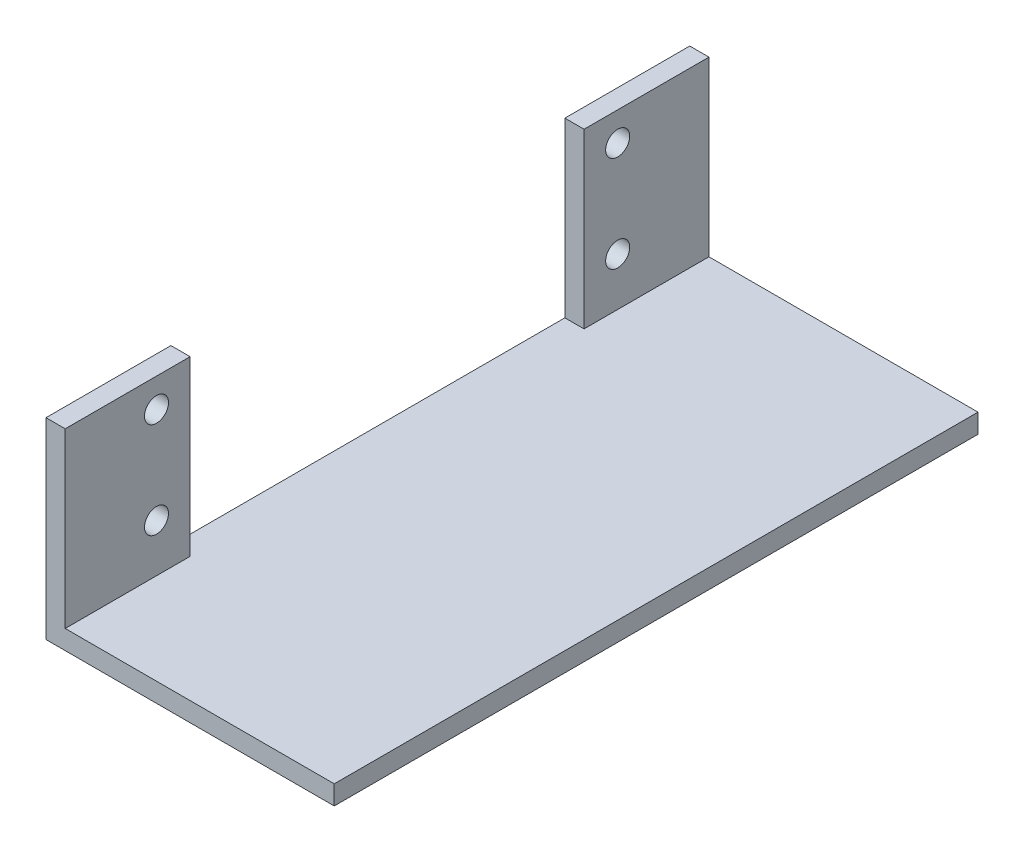
ISO-10303-21;
HEADER;
FILE_DESCRIPTION(('STEP AP214'),'2;1');
FILE_NAME('part.step','',(''),(''),'','','');
FILE_SCHEMA(('AUTOMOTIVE_DESIGN { 1 0 10303 214 1 1 1 1 }'));
ENDSEC;
DATA;
#1=APPLICATION_CONTEXT('core data for automotive mechanical design processes');
#2=APPLICATION_PROTOCOL_DEFINITION('international standard','automotive_design',2000,#1);
#3=PRODUCT_CONTEXT('',#1,'mechanical');
#4=PRODUCT('Part','Part','',(#3));
#5=PRODUCT_RELATED_PRODUCT_CATEGORY('part','',(#4));
#6=PRODUCT_DEFINITION_FORMATION('','',#4);
#7=PRODUCT_DEFINITION_CONTEXT('part definition',#1,'design');
#8=PRODUCT_DEFINITION('design','',#6,#7);
#9=PRODUCT_DEFINITION_SHAPE('','',#8);
#10=(LENGTH_UNIT() NAMED_UNIT(*) SI_UNIT(.MILLI.,.METRE.));
#11=(NAMED_UNIT(*) PLANE_ANGLE_UNIT() SI_UNIT($,.RADIAN.));
#12=(NAMED_UNIT(*) SI_UNIT($,.STERADIAN.) SOLID_ANGLE_UNIT());
#13=UNCERTAINTY_MEASURE_WITH_UNIT(LENGTH_MEASURE(1.E-05),#10,'distance_accuracy_value','');
#14=(GEOMETRIC_REPRESENTATION_CONTEXT(3) GLOBAL_UNCERTAINTY_ASSIGNED_CONTEXT((#13)) GLOBAL_UNIT_ASSIGNED_CONTEXT((#10,
#11,#12)) REPRESENTATION_CONTEXT('',''));
#15=CARTESIAN_POINT('',(0.,0.,0.));
#16=DIRECTION('',(0.,0.,1.));
#17=DIRECTION('',(1.,0.,0.));
#18=AXIS2_PLACEMENT_3D('',#15,#16,#17);
#19=CARTESIAN_POINT('',(2.,20.,33.5));
#20=DIRECTION('',(1.,0.,0.));
#21=DIRECTION('',(0.,0.,-1.));
#22=AXIS2_PLACEMENT_3D('',#19,#20,#21);
#23=PLANE('',#22);
#24=DIRECTION('',(0.,1.,0.));
#25=VECTOR('',#24,1.);
#26=CARTESIAN_POINT('',(2.,20.,20.5));
#27=LINE('',#26,#25);
#28=CARTESIAN_POINT('',(2.,2.,20.5));
#29=VERTEX_POINT('',#28);
#30=CARTESIAN_POINT('',(2.,20.,20.5));
#31=VERTEX_POINT('',#30);
#32=EDGE_CURVE('E111',#29,#31,#27,.T.);
#33=ORIENTED_EDGE('',*,*,#32,.T.);
#34=DIRECTION('',(0.,0.,-1.));
#35=VECTOR('',#34,1.);
#36=CARTESIAN_POINT('',(2.,20.,33.5));
#37=LINE('',#36,#35);
#38=CARTESIAN_POINT('',(2.,20.,33.5));
#39=VERTEX_POINT('',#38);
#40=EDGE_CURVE('E104',#39,#31,#37,.T.);
#41=ORIENTED_EDGE('',*,*,#40,.F.);
#42=DIRECTION('',(0.,1.,0.));
#43=VECTOR('',#42,1.);
#44=CARTESIAN_POINT('',(2.,20.,33.5));
#45=LINE('',#44,#43);
#46=CARTESIAN_POINT('',(2.,2.,33.5));
#47=VERTEX_POINT('',#46);
#48=EDGE_CURVE('E108',#39,#47,#45,.F.);
#49=ORIENTED_EDGE('',*,*,#48,.T.);
#50=DIRECTION('',(0.,0.,-1.));
#51=VECTOR('',#50,1.);
#52=CARTESIAN_POINT('',(2.,2.,33.5));
#53=LINE('',#52,#51);
#54=EDGE_CURVE('E152',#47,#29,#53,.T.);
#55=ORIENTED_EDGE('',*,*,#54,.T.);
#56=EDGE_LOOP('',(#33,#41,#49,#55));
#57=FACE_BOUND('',#56,.T.);
#58=CARTESIAN_POINT('',(2.,17.,24.));
#59=DIRECTION('',(1.,0.,0.));
#60=DIRECTION('',(0.,0.,-1.));
#61=AXIS2_PLACEMENT_3D('',#58,#59,#60);
#62=CIRCLE('',#61,1.25);
#63=CARTESIAN_POINT('',(2.,17.,22.75));
#64=VERTEX_POINT('',#63);
#65=EDGE_CURVE('E209',#64,#64,#62,.F.);
#66=ORIENTED_EDGE('',*,*,#65,.T.);
#67=EDGE_LOOP('',(#66));
#68=FACE_BOUND('',#67,.T.);
#69=CARTESIAN_POINT('',(2.,7.,24.));
#70=DIRECTION('',(1.,0.,0.));
#71=DIRECTION('',(0.,0.,-1.));
#72=AXIS2_PLACEMENT_3D('',#69,#70,#71);
#73=CIRCLE('',#72,1.25);
#74=CARTESIAN_POINT('',(2.,7.,22.75));
#75=VERTEX_POINT('',#74);
#76=EDGE_CURVE('E208',#75,#75,#73,.F.);
#77=ORIENTED_EDGE('',*,*,#76,.T.);
#78=EDGE_LOOP('',(#77));
#79=FACE_BOUND('',#78,.T.);
#80=ADVANCED_FACE('F33',(#57,#68,#79),#23,.T.);
#81=CARTESIAN_POINT('',(0.,20.,33.5));
#82=DIRECTION('',(0.,1.,0.));
#83=DIRECTION('',(0.,0.,1.));
#84=AXIS2_PLACEMENT_3D('',#81,#82,#83);
#85=PLANE('',#84);
#86=DIRECTION('',(-1.,0.,0.));
#87=VECTOR('',#86,1.);
#88=CARTESIAN_POINT('',(46.7772263544762,20.,20.5));
#89=LINE('',#88,#87);
#90=CARTESIAN_POINT('',(0.,20.,20.5));
#91=VERTEX_POINT('',#90);
#92=EDGE_CURVE('E195',#31,#91,#89,.T.);
#93=ORIENTED_EDGE('',*,*,#92,.T.);
#94=DIRECTION('',(0.,0.,-1.));
#95=VECTOR('',#94,1.);
#96=CARTESIAN_POINT('',(0.,20.,33.5));
#97=LINE('',#96,#95);
#98=CARTESIAN_POINT('',(0.,20.,33.5));
#99=VERTEX_POINT('',#98);
#100=EDGE_CURVE('E126',#99,#91,#97,.T.);
#101=ORIENTED_EDGE('',*,*,#100,.F.);
#102=DIRECTION('',(1.,0.,0.));
#103=VECTOR('',#102,1.);
#104=CARTESIAN_POINT('',(0.,20.,33.5));
#105=LINE('',#104,#103);
#106=EDGE_CURVE('E120',#99,#39,#105,.T.);
#107=ORIENTED_EDGE('',*,*,#106,.T.);
#108=ORIENTED_EDGE('',*,*,#40,.T.);
#109=EDGE_LOOP('',(#93,#101,#107,#108));
#110=FACE_BOUND('',#109,.T.);
#111=ADVANCED_FACE('F124',(#110),#85,.T.);
#112=CARTESIAN_POINT('',(0.,0.,33.5));
#113=DIRECTION('',(0.,1.,0.));
#114=DIRECTION('',(0.,0.,1.));
#115=AXIS2_PLACEMENT_3D('',#112,#113,#114);
#116=PLANE('',#115);
#117=DIRECTION('',(1.,0.,0.));
#118=VECTOR('',#117,1.);
#119=CARTESIAN_POINT('',(0.,0.,-33.5));
#120=LINE('',#119,#118);
#121=CARTESIAN_POINT('',(0.,0.,-33.5));
#122=VERTEX_POINT('',#121);
#123=CARTESIAN_POINT('',(30.,0.,-33.5));
#124=VERTEX_POINT('',#123);
#125=EDGE_CURVE('E132',#122,#124,#120,.T.);
#126=ORIENTED_EDGE('',*,*,#125,.T.);
#127=DIRECTION('',(0.,0.,-1.));
#128=VECTOR('',#127,1.);
#129=CARTESIAN_POINT('',(30.,0.,33.5));
#130=LINE('',#129,#128);
#131=CARTESIAN_POINT('',(30.,0.,33.5));
#132=VERTEX_POINT('',#131);
#133=EDGE_CURVE('E11',#132,#124,#130,.T.);
#134=ORIENTED_EDGE('',*,*,#133,.F.);
#135=DIRECTION('',(1.,0.,0.));
#136=VECTOR('',#135,1.);
#137=CARTESIAN_POINT('',(0.,0.,33.5));
#138=LINE('',#137,#136);
#139=CARTESIAN_POINT('',(0.,0.,33.5));
#140=VERTEX_POINT('',#139);
#141=EDGE_CURVE('E89',#140,#132,#138,.T.);
#142=ORIENTED_EDGE('',*,*,#141,.F.);
#143=DIRECTION('',(0.,0.,-1.));
#144=VECTOR('',#143,1.);
#145=CARTESIAN_POINT('',(0.,0.,33.5));
#146=LINE('',#145,#144);
#147=EDGE_CURVE('E128',#140,#122,#146,.T.);
#148=ORIENTED_EDGE('',*,*,#147,.T.);
#149=EDGE_LOOP('',(#126,#134,#142,#148));
#150=FACE_BOUND('',#149,.T.);
#151=ADVANCED_FACE('F35',(#150),#116,.F.);
#152=CARTESIAN_POINT('',(30.,2.,33.5));
#153=DIRECTION('',(1.,0.,0.));
#154=DIRECTION('',(0.,0.,-1.));
#155=AXIS2_PLACEMENT_3D('',#152,#153,#154);
#156=PLANE('',#155);
#157=DIRECTION('',(0.,-1.,0.));
#158=VECTOR('',#157,1.);
#159=CARTESIAN_POINT('',(30.,2.,-33.5));
#160=LINE('',#159,#158);
#161=CARTESIAN_POINT('',(30.,2.,-33.5));
#162=VERTEX_POINT('',#161);
#163=EDGE_CURVE('E135',#162,#124,#160,.T.);
#164=ORIENTED_EDGE('',*,*,#163,.F.);
#165=DIRECTION('',(0.,0.,-1.));
#166=VECTOR('',#165,1.);
#167=CARTESIAN_POINT('',(30.,2.,33.5));
#168=LINE('',#167,#166);
#169=CARTESIAN_POINT('',(30.,2.,33.5));
#170=VERTEX_POINT('',#169);
#171=EDGE_CURVE('E41',#170,#162,#168,.T.);
#172=ORIENTED_EDGE('',*,*,#171,.F.);
#173=DIRECTION('',(0.,-1.,0.));
#174=VECTOR('',#173,1.);
#175=CARTESIAN_POINT('',(30.,2.,33.5));
#176=LINE('',#175,#174);
#177=EDGE_CURVE('E218',#170,#132,#176,.T.);
#178=ORIENTED_EDGE('',*,*,#177,.T.);
#179=ORIENTED_EDGE('',*,*,#133,.T.);
#180=EDGE_LOOP('',(#164,#172,#178,#179));
#181=FACE_BOUND('',#180,.T.);
#182=ADVANCED_FACE('F160',(#181),#156,.T.);
#183=CARTESIAN_POINT('',(0.,2.,33.5));
#184=DIRECTION('',(0.,1.,0.));
#185=DIRECTION('',(0.,0.,1.));
#186=AXIS2_PLACEMENT_3D('',#183,#184,#185);
#187=PLANE('',#186);
#188=DIRECTION('',(1.,0.,0.));
#189=VECTOR('',#188,1.);
#190=CARTESIAN_POINT('',(0.,2.,-33.5));
#191=LINE('',#190,#189);
#192=CARTESIAN_POINT('',(2.,2.,-33.5));
#193=VERTEX_POINT('',#192);
#194=EDGE_CURVE('E139',#193,#162,#191,.T.);
#195=ORIENTED_EDGE('',*,*,#194,.F.);
#196=CARTESIAN_POINT('',(2.,2.,-20.5));
#197=VERTEX_POINT('',#196);
#198=EDGE_CURVE('E115',#197,#193,#53,.T.);
#199=ORIENTED_EDGE('',*,*,#198,.F.);
#200=DIRECTION('',(-1.,0.,0.));
#201=VECTOR('',#200,1.);
#202=CARTESIAN_POINT('',(46.7772263544762,2.,-20.5));
#203=LINE('',#202,#201);
#204=CARTESIAN_POINT('',(0.,2.,-20.5));
#205=VERTEX_POINT('',#204);
#206=EDGE_CURVE('E176',#197,#205,#203,.T.);
#207=ORIENTED_EDGE('',*,*,#206,.T.);
#208=DIRECTION('',(0.,0.,1.));
#209=VECTOR('',#208,1.);
#210=CARTESIAN_POINT('',(0.,2.,-20.5));
#211=LINE('',#210,#209);
#212=CARTESIAN_POINT('',(0.,2.,20.5));
#213=VERTEX_POINT('',#212);
#214=EDGE_CURVE('E261',#205,#213,#211,.T.);
#215=ORIENTED_EDGE('',*,*,#214,.T.);
#216=DIRECTION('',(-1.,0.,0.));
#217=VECTOR('',#216,1.);
#218=CARTESIAN_POINT('',(46.7772263544762,2.,20.5));
#219=LINE('',#218,#217);
#220=EDGE_CURVE('E200',#29,#213,#219,.T.);
#221=ORIENTED_EDGE('',*,*,#220,.F.);
#222=ORIENTED_EDGE('',*,*,#54,.F.);
#223=DIRECTION('',(1.,0.,0.));
#224=VECTOR('',#223,1.);
#225=CARTESIAN_POINT('',(0.,2.,33.5));
#226=LINE('',#225,#224);
#227=EDGE_CURVE('E122',#47,#170,#226,.T.);
#228=ORIENTED_EDGE('',*,*,#227,.T.);
#229=ORIENTED_EDGE('',*,*,#171,.T.);
#230=EDGE_LOOP('',(#195,#199,#207,#215,#221,#222,#228,#229));
#231=FACE_BOUND('',#230,.T.);
#232=ADVANCED_FACE('F156',(#231),#187,.T.);
#233=DIRECTION('',(0.,-1.,0.));
#234=VECTOR('',#233,1.);
#235=CARTESIAN_POINT('',(2.,20.,-20.5));
#236=LINE('',#235,#234);
#237=CARTESIAN_POINT('',(2.,20.,-20.5));
#238=VERTEX_POINT('',#237);
#239=EDGE_CURVE('E172',#238,#197,#236,.T.);
#240=ORIENTED_EDGE('',*,*,#239,.T.);
#241=ORIENTED_EDGE('',*,*,#198,.T.);
#242=DIRECTION('',(0.,1.,0.));
#243=VECTOR('',#242,1.);
#244=CARTESIAN_POINT('',(2.,20.,-33.5));
#245=LINE('',#244,#243);
#246=CARTESIAN_POINT('',(2.,20.,-33.5));
#247=VERTEX_POINT('',#246);
#248=EDGE_CURVE('E142',#247,#193,#245,.F.);
#249=ORIENTED_EDGE('',*,*,#248,.F.);
#250=EDGE_CURVE('E116',#238,#247,#37,.T.);
#251=ORIENTED_EDGE('',*,*,#250,.F.);
#252=EDGE_LOOP('',(#240,#241,#249,#251));
#253=FACE_BOUND('',#252,.T.);
#254=CARTESIAN_POINT('',(2.,17.,-24.));
#255=DIRECTION('',(1.,0.,0.));
#256=DIRECTION('',(0.,0.,-1.));
#257=AXIS2_PLACEMENT_3D('',#254,#255,#256);
#258=CIRCLE('',#257,1.25);
#259=CARTESIAN_POINT('',(2.,17.,-25.25));
#260=VERTEX_POINT('',#259);
#261=EDGE_CURVE('E265',#260,#260,#258,.F.);
#262=ORIENTED_EDGE('',*,*,#261,.T.);
#263=EDGE_LOOP('',(#262));
#264=FACE_BOUND('',#263,.T.);
#265=CARTESIAN_POINT('',(2.,7.,-24.));
#266=DIRECTION('',(1.,0.,0.));
#267=DIRECTION('',(0.,0.,-1.));
#268=AXIS2_PLACEMENT_3D('',#265,#266,#267);
#269=CIRCLE('',#268,1.25);
#270=CARTESIAN_POINT('',(2.,7.,-25.25));
#271=VERTEX_POINT('',#270);
#272=EDGE_CURVE('E136',#271,#271,#269,.F.);
#273=ORIENTED_EDGE('',*,*,#272,.T.);
#274=EDGE_LOOP('',(#273));
#275=FACE_BOUND('',#274,.T.);
#276=ADVANCED_FACE('F169',(#253,#264,#275),#23,.T.);
#277=DIRECTION('',(-1.,0.,0.));
#278=VECTOR('',#277,1.);
#279=CARTESIAN_POINT('',(46.7772263544762,20.,-20.5));
#280=LINE('',#279,#278);
#281=CARTESIAN_POINT('',(0.,20.,-20.5));
#282=VERTEX_POINT('',#281);
#283=EDGE_CURVE('E48',#238,#282,#280,.T.);
#284=ORIENTED_EDGE('',*,*,#283,.F.);
#285=ORIENTED_EDGE('',*,*,#250,.T.);
#286=DIRECTION('',(1.,0.,0.));
#287=VECTOR('',#286,1.);
#288=CARTESIAN_POINT('',(0.,20.,-33.5));
#289=LINE('',#288,#287);
#290=CARTESIAN_POINT('',(0.,20.,-33.5));
#291=VERTEX_POINT('',#290);
#292=EDGE_CURVE('E145',#291,#247,#289,.T.);
#293=ORIENTED_EDGE('',*,*,#292,.F.);
#294=EDGE_CURVE('E150',#282,#291,#97,.T.);
#295=ORIENTED_EDGE('',*,*,#294,.F.);
#296=EDGE_LOOP('',(#284,#285,#293,#295));
#297=FACE_BOUND('',#296,.T.);
#298=ADVANCED_FACE('F194',(#297),#85,.T.);
#299=CARTESIAN_POINT('',(0.,20.,33.5));
#300=DIRECTION('',(1.,0.,0.));
#301=DIRECTION('',(0.,0.,-1.));
#302=AXIS2_PLACEMENT_3D('',#299,#300,#301);
#303=PLANE('',#302);
#304=CARTESIAN_POINT('',(0.,7.,24.));
#305=DIRECTION('',(-1.,0.,0.));
#306=DIRECTION('',(0.,0.,1.));
#307=AXIS2_PLACEMENT_3D('',#304,#305,#306);
#308=CIRCLE('',#307,1.25);
#309=CARTESIAN_POINT('',(0.,7.,25.25));
#310=VERTEX_POINT('',#309);
#311=EDGE_CURVE('E205',#310,#310,#308,.T.);
#312=ORIENTED_EDGE('',*,*,#311,.F.);
#313=EDGE_LOOP('',(#312));
#314=FACE_BOUND('',#313,.T.);
#315=CARTESIAN_POINT('',(0.,17.,24.));
#316=DIRECTION('',(-1.,0.,0.));
#317=DIRECTION('',(0.,0.,1.));
#318=AXIS2_PLACEMENT_3D('',#315,#316,#317);
#319=CIRCLE('',#318,1.25);
#320=CARTESIAN_POINT('',(0.,17.,25.25));
#321=VERTEX_POINT('',#320);
#322=EDGE_CURVE('E269',#321,#321,#319,.T.);
#323=ORIENTED_EDGE('',*,*,#322,.F.);
#324=EDGE_LOOP('',(#323));
#325=FACE_BOUND('',#324,.T.);
#326=CARTESIAN_POINT('',(0.,17.,-24.));
#327=DIRECTION('',(-1.,0.,0.));
#328=DIRECTION('',(0.,0.,1.));
#329=AXIS2_PLACEMENT_3D('',#326,#327,#328);
#330=CIRCLE('',#329,1.25);
#331=CARTESIAN_POINT('',(0.,17.,-22.75));
#332=VERTEX_POINT('',#331);
#333=EDGE_CURVE('E270',#332,#332,#330,.T.);
#334=ORIENTED_EDGE('',*,*,#333,.F.);
#335=EDGE_LOOP('',(#334));
#336=FACE_BOUND('',#335,.T.);
#337=CARTESIAN_POINT('',(0.,7.,-24.));
#338=DIRECTION('',(-1.,0.,0.));
#339=DIRECTION('',(0.,0.,1.));
#340=AXIS2_PLACEMENT_3D('',#337,#338,#339);
#341=CIRCLE('',#340,1.25);
#342=CARTESIAN_POINT('',(0.,7.,-22.75));
#343=VERTEX_POINT('',#342);
#344=EDGE_CURVE('E204',#343,#343,#341,.T.);
#345=ORIENTED_EDGE('',*,*,#344,.F.);
#346=EDGE_LOOP('',(#345));
#347=FACE_BOUND('',#346,.T.);
#348=ORIENTED_EDGE('',*,*,#100,.T.);
#349=DIRECTION('',(0.,1.,0.));
#350=VECTOR('',#349,1.);
#351=CARTESIAN_POINT('',(0.,20.,20.5));
#352=LINE('',#351,#350);
#353=EDGE_CURVE('E202',#213,#91,#352,.T.);
#354=ORIENTED_EDGE('',*,*,#353,.F.);
#355=ORIENTED_EDGE('',*,*,#214,.F.);
#356=DIRECTION('',(0.,-1.,0.));
#357=VECTOR('',#356,1.);
#358=CARTESIAN_POINT('',(0.,20.,-20.5));
#359=LINE('',#358,#357);
#360=EDGE_CURVE('E212',#282,#205,#359,.T.);
#361=ORIENTED_EDGE('',*,*,#360,.F.);
#362=ORIENTED_EDGE('',*,*,#294,.T.);
#363=DIRECTION('',(0.,-1.,0.));
#364=VECTOR('',#363,1.);
#365=CARTESIAN_POINT('',(0.,20.,-33.5));
#366=LINE('',#365,#364);
#367=EDGE_CURVE('E83',#291,#122,#366,.T.);
#368=ORIENTED_EDGE('',*,*,#367,.T.);
#369=ORIENTED_EDGE('',*,*,#147,.F.);
#370=DIRECTION('',(0.,-1.,0.));
#371=VECTOR('',#370,1.);
#372=CARTESIAN_POINT('',(0.,20.,33.5));
#373=LINE('',#372,#371);
#374=EDGE_CURVE('E57',#99,#140,#373,.T.);
#375=ORIENTED_EDGE('',*,*,#374,.F.);
#376=EDGE_LOOP('',(#348,#354,#355,#361,#362,#368,#369,#375));
#377=FACE_BOUND('',#376,.T.);
#378=ADVANCED_FACE('F249',(#314,#325,#336,#347,#377),#303,.F.);
#379=CARTESIAN_POINT('',(0.,0.,33.5));
#380=DIRECTION('',(0.,0.,-1.));
#381=DIRECTION('',(-1.,0.,0.));
#382=AXIS2_PLACEMENT_3D('',#379,#380,#381);
#383=PLANE('',#382);
#384=ORIENTED_EDGE('',*,*,#141,.T.);
#385=ORIENTED_EDGE('',*,*,#177,.F.);
#386=ORIENTED_EDGE('',*,*,#227,.F.);
#387=ORIENTED_EDGE('',*,*,#48,.F.);
#388=ORIENTED_EDGE('',*,*,#106,.F.);
#389=ORIENTED_EDGE('',*,*,#374,.T.);
#390=EDGE_LOOP('',(#384,#385,#386,#387,#388,#389));
#391=FACE_BOUND('',#390,.T.);
#392=ADVANCED_FACE('F119',(#391),#383,.F.);
#393=CARTESIAN_POINT('',(0.,0.,-33.5));
#394=DIRECTION('',(0.,0.,-1.));
#395=DIRECTION('',(-1.,0.,0.));
#396=AXIS2_PLACEMENT_3D('',#393,#394,#395);
#397=PLANE('',#396);
#398=ORIENTED_EDGE('',*,*,#125,.F.);
#399=ORIENTED_EDGE('',*,*,#367,.F.);
#400=ORIENTED_EDGE('',*,*,#292,.T.);
#401=ORIENTED_EDGE('',*,*,#248,.T.);
#402=ORIENTED_EDGE('',*,*,#194,.T.);
#403=ORIENTED_EDGE('',*,*,#163,.T.);
#404=EDGE_LOOP('',(#398,#399,#400,#401,#402,#403));
#405=FACE_BOUND('',#404,.T.);
#406=ADVANCED_FACE('F163',(#405),#397,.T.);
#407=CARTESIAN_POINT('',(46.7772263544762,7.,-24.));
#408=DIRECTION('',(-1.,0.,0.));
#409=DIRECTION('',(0.,0.,1.));
#410=AXIS2_PLACEMENT_3D('',#407,#408,#409);
#411=CYLINDRICAL_SURFACE('',#410,1.25);
#412=ORIENTED_EDGE('',*,*,#344,.T.);
#413=EDGE_LOOP('',(#412));
#414=FACE_BOUND('',#413,.T.);
#415=ORIENTED_EDGE('',*,*,#272,.F.);
#416=EDGE_LOOP('',(#415));
#417=FACE_BOUND('',#416,.T.);
#418=ADVANCED_FACE('F222',(#414,#417),#411,.F.);
#419=CARTESIAN_POINT('',(46.7772263544762,17.,-24.));
#420=DIRECTION('',(-1.,0.,0.));
#421=DIRECTION('',(0.,0.,1.));
#422=AXIS2_PLACEMENT_3D('',#419,#420,#421);
#423=CYLINDRICAL_SURFACE('',#422,1.25);
#424=ORIENTED_EDGE('',*,*,#333,.T.);
#425=EDGE_LOOP('',(#424));
#426=FACE_BOUND('',#425,.T.);
#427=ORIENTED_EDGE('',*,*,#261,.F.);
#428=EDGE_LOOP('',(#427));
#429=FACE_BOUND('',#428,.T.);
#430=ADVANCED_FACE('F224',(#426,#429),#423,.F.);
#431=CARTESIAN_POINT('',(46.7772263544762,17.,24.));
#432=DIRECTION('',(-1.,0.,0.));
#433=DIRECTION('',(0.,0.,1.));
#434=AXIS2_PLACEMENT_3D('',#431,#432,#433);
#435=CYLINDRICAL_SURFACE('',#434,1.25);
#436=ORIENTED_EDGE('',*,*,#322,.T.);
#437=EDGE_LOOP('',(#436));
#438=FACE_BOUND('',#437,.T.);
#439=ORIENTED_EDGE('',*,*,#65,.F.);
#440=EDGE_LOOP('',(#439));
#441=FACE_BOUND('',#440,.T.);
#442=ADVANCED_FACE('F231',(#438,#441),#435,.F.);
#443=CARTESIAN_POINT('',(46.7772263544762,7.,24.));
#444=DIRECTION('',(-1.,0.,0.));
#445=DIRECTION('',(0.,0.,1.));
#446=AXIS2_PLACEMENT_3D('',#443,#444,#445);
#447=CYLINDRICAL_SURFACE('',#446,1.25);
#448=ORIENTED_EDGE('',*,*,#311,.T.);
#449=EDGE_LOOP('',(#448));
#450=FACE_BOUND('',#449,.T.);
#451=ORIENTED_EDGE('',*,*,#76,.F.);
#452=EDGE_LOOP('',(#451));
#453=FACE_BOUND('',#452,.T.);
#454=ADVANCED_FACE('F294',(#450,#453),#447,.F.);
#455=CARTESIAN_POINT('',(46.7772263544762,20.,20.5));
#456=DIRECTION('',(0.,0.,1.));
#457=DIRECTION('',(0.,-1.,0.));
#458=AXIS2_PLACEMENT_3D('',#455,#456,#457);
#459=PLANE('',#458);
#460=ORIENTED_EDGE('',*,*,#220,.T.);
#461=ORIENTED_EDGE('',*,*,#353,.T.);
#462=ORIENTED_EDGE('',*,*,#92,.F.);
#463=ORIENTED_EDGE('',*,*,#32,.F.);
#464=EDGE_LOOP('',(#460,#461,#462,#463));
#465=FACE_BOUND('',#464,.T.);
#466=ADVANCED_FACE('F297',(#465),#459,.F.);
#467=CARTESIAN_POINT('',(46.7772263544762,20.,-20.5));
#468=DIRECTION('',(0.,0.,-1.));
#469=DIRECTION('',(0.,1.,0.));
#470=AXIS2_PLACEMENT_3D('',#467,#468,#469);
#471=PLANE('',#470);
#472=ORIENTED_EDGE('',*,*,#283,.T.);
#473=ORIENTED_EDGE('',*,*,#360,.T.);
#474=ORIENTED_EDGE('',*,*,#206,.F.);
#475=ORIENTED_EDGE('',*,*,#239,.F.);
#476=EDGE_LOOP('',(#472,#473,#474,#475));
#477=FACE_BOUND('',#476,.T.);
#478=ADVANCED_FACE('F190',(#477),#471,.F.);
#479=CLOSED_SHELL('',(#80,#111,#151,#182,#232,#276,#298,#378,#392,#406,#418,#430,#442,#454,#466,#478));
#480=MANIFOLD_SOLID_BREP('B2',#479);
#481=ADVANCED_BREP_SHAPE_REPRESENTATION('',(#18,#480),#14);
#482=SHAPE_DEFINITION_REPRESENTATION(#9,#481);
ENDSEC;
END-ISO-10303-21;
